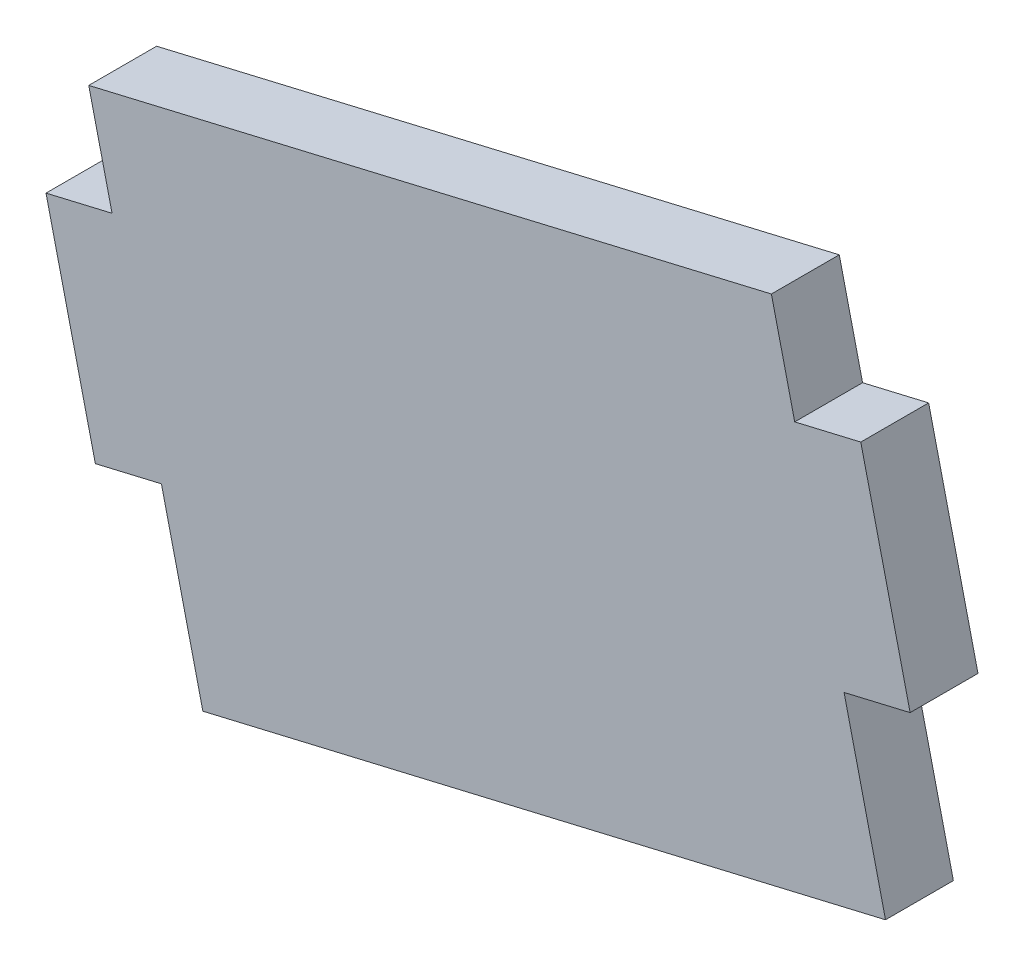
ISO-10303-21;
HEADER;
FILE_DESCRIPTION(('STEP AP214'),'2;1');
FILE_NAME('part.step','',(''),(''),'','','');
FILE_SCHEMA(('AUTOMOTIVE_DESIGN { 1 0 10303 214 1 1 1 1 }'));
ENDSEC;
DATA;
#1=APPLICATION_CONTEXT('core data for automotive mechanical design processes');
#2=APPLICATION_PROTOCOL_DEFINITION('international standard','automotive_design',2000,#1);
#3=PRODUCT_CONTEXT('',#1,'mechanical');
#4=PRODUCT('Part','Part','',(#3));
#5=PRODUCT_RELATED_PRODUCT_CATEGORY('part','',(#4));
#6=PRODUCT_DEFINITION_FORMATION('','',#4);
#7=PRODUCT_DEFINITION_CONTEXT('part definition',#1,'design');
#8=PRODUCT_DEFINITION('design','',#6,#7);
#9=PRODUCT_DEFINITION_SHAPE('','',#8);
#10=(LENGTH_UNIT() NAMED_UNIT(*) SI_UNIT(.MILLI.,.METRE.));
#11=(NAMED_UNIT(*) PLANE_ANGLE_UNIT() SI_UNIT($,.RADIAN.));
#12=(NAMED_UNIT(*) SI_UNIT($,.STERADIAN.) SOLID_ANGLE_UNIT());
#13=UNCERTAINTY_MEASURE_WITH_UNIT(LENGTH_MEASURE(1.E-05),#10,'distance_accuracy_value','');
#14=(GEOMETRIC_REPRESENTATION_CONTEXT(3) GLOBAL_UNCERTAINTY_ASSIGNED_CONTEXT((#13)) GLOBAL_UNIT_ASSIGNED_CONTEXT((#10,
#11,#12)) REPRESENTATION_CONTEXT('',''));
#15=CARTESIAN_POINT('',(0.,0.,0.));
#16=DIRECTION('',(0.,0.,1.));
#17=DIRECTION('',(1.,0.,0.));
#18=AXIS2_PLACEMENT_3D('',#15,#16,#17);
#19=CARTESIAN_POINT('',(643.040286554678,392.206492508057,3.));
#20=DIRECTION('',(0.229108301401089,-0.973400938066688,0.));
#21=DIRECTION('',(0.973400938066688,0.229108301401089,0.));
#22=AXIS2_PLACEMENT_3D('',#19,#20,#21);
#23=PLANE('',#22);
#24=DIRECTION('',(-0.973400938066688,-0.229108301401089,0.));
#25=VECTOR('',#24,1.);
#26=CARTESIAN_POINT('',(643.040286554678,392.206492508057,0.));
#27=LINE('',#26,#25);
#28=CARTESIAN_POINT('',(645.960489368878,392.893817412261,0.));
#29=VERTEX_POINT('',#28);
#30=CARTESIAN_POINT('',(643.040286554678,392.206492508057,0.));
#31=VERTEX_POINT('',#30);
#32=EDGE_CURVE('E124',#29,#31,#27,.T.);
#33=ORIENTED_EDGE('',*,*,#32,.T.);
#34=DIRECTION('',(0.,0.,-1.));
#35=VECTOR('',#34,1.);
#36=CARTESIAN_POINT('',(643.040286554678,392.206492508057,3.));
#37=LINE('',#36,#35);
#38=CARTESIAN_POINT('',(643.040286554678,392.206492508057,3.));
#39=VERTEX_POINT('',#38);
#40=EDGE_CURVE('E11',#39,#31,#37,.T.);
#41=ORIENTED_EDGE('',*,*,#40,.F.);
#42=DIRECTION('',(-0.973400938066688,-0.229108301401089,0.));
#43=VECTOR('',#42,1.);
#44=CARTESIAN_POINT('',(643.040286554678,392.206492508057,3.));
#45=LINE('',#44,#43);
#46=CARTESIAN_POINT('',(645.960489368878,392.893817412261,3.));
#47=VERTEX_POINT('',#46);
#48=EDGE_CURVE('E159',#47,#39,#45,.T.);
#49=ORIENTED_EDGE('',*,*,#48,.F.);
#50=DIRECTION('',(0.,0.,-1.));
#51=VECTOR('',#50,1.);
#52=CARTESIAN_POINT('',(645.960489368878,392.893817412261,3.));
#53=LINE('',#52,#51);
#54=EDGE_CURVE('E137',#47,#29,#53,.T.);
#55=ORIENTED_EDGE('',*,*,#54,.T.);
#56=EDGE_LOOP('',(#33,#41,#49,#55));
#57=FACE_BOUND('',#56,.T.);
#58=ADVANCED_FACE('F32',(#57),#23,.F.);
#59=CARTESIAN_POINT('',(643.040286554678,392.206492508057,3.));
#60=DIRECTION('',(-0.973400938066693,-0.229108301401068,0.));
#61=DIRECTION('',(0.229108301401069,-0.973400938066693,0.));
#62=AXIS2_PLACEMENT_3D('',#59,#60,#61);
#63=PLANE('',#62);
#64=DIRECTION('',(-0.229108301401068,0.973400938066693,0.));
#65=VECTOR('',#64,1.);
#66=CARTESIAN_POINT('',(643.040286554678,392.206492508057,0.));
#67=LINE('',#66,#65);
#68=CARTESIAN_POINT('',(642.009299198373,396.586796729357,0.));
#69=VERTEX_POINT('',#68);
#70=EDGE_CURVE('E120',#31,#69,#67,.T.);
#71=ORIENTED_EDGE('',*,*,#70,.T.);
#72=DIRECTION('',(0.,0.,-1.));
#73=VECTOR('',#72,1.);
#74=CARTESIAN_POINT('',(642.009299198373,396.586796729357,3.));
#75=LINE('',#74,#73);
#76=CARTESIAN_POINT('',(642.009299198373,396.586796729357,3.));
#77=VERTEX_POINT('',#76);
#78=EDGE_CURVE('E39',#77,#69,#75,.T.);
#79=ORIENTED_EDGE('',*,*,#78,.F.);
#80=DIRECTION('',(-0.229108301401068,0.973400938066693,0.));
#81=VECTOR('',#80,1.);
#82=CARTESIAN_POINT('',(643.040286554678,392.206492508057,3.));
#83=LINE('',#82,#81);
#84=EDGE_CURVE('E133',#39,#77,#83,.T.);
#85=ORIENTED_EDGE('',*,*,#84,.F.);
#86=ORIENTED_EDGE('',*,*,#40,.T.);
#87=EDGE_LOOP('',(#71,#79,#85,#86));
#88=FACE_BOUND('',#87,.T.);
#89=ADVANCED_FACE('F132',(#88),#63,.F.);
#90=CARTESIAN_POINT('',(642.009299198373,396.586796729357,3.));
#91=DIRECTION('',(0.229108301401082,-0.973400938066689,0.));
#92=DIRECTION('',(0.973400938066689,0.229108301401082,0.));
#93=AXIS2_PLACEMENT_3D('',#90,#91,#92);
#94=PLANE('',#93);
#95=DIRECTION('',(-0.973400938066689,-0.229108301401082,0.));
#96=VECTOR('',#95,1.);
#97=CARTESIAN_POINT('',(642.009299198373,396.586796729357,0.));
#98=LINE('',#97,#96);
#99=CARTESIAN_POINT('',(611.833870118305,389.484439385924,0.));
#100=VERTEX_POINT('',#99);
#101=EDGE_CURVE('E126',#69,#100,#98,.T.);
#102=ORIENTED_EDGE('',*,*,#101,.T.);
#103=DIRECTION('',(0.,0.,-1.));
#104=VECTOR('',#103,1.);
#105=CARTESIAN_POINT('',(611.833870118305,389.484439385924,3.));
#106=LINE('',#105,#104);
#107=CARTESIAN_POINT('',(611.833870118305,389.484439385924,3.));
#108=VERTEX_POINT('',#107);
#109=EDGE_CURVE('E205',#108,#100,#106,.T.);
#110=ORIENTED_EDGE('',*,*,#109,.F.);
#111=DIRECTION('',(-0.973400938066689,-0.229108301401082,0.));
#112=VECTOR('',#111,1.);
#113=CARTESIAN_POINT('',(642.009299198373,396.586796729357,3.));
#114=LINE('',#113,#112);
#115=EDGE_CURVE('E162',#77,#108,#114,.T.);
#116=ORIENTED_EDGE('',*,*,#115,.F.);
#117=ORIENTED_EDGE('',*,*,#78,.T.);
#118=EDGE_LOOP('',(#102,#110,#116,#117));
#119=FACE_BOUND('',#118,.T.);
#120=ADVANCED_FACE('F209',(#119),#94,.F.);
#121=CARTESIAN_POINT('',(612.86485747461,385.104135164624,3.));
#122=DIRECTION('',(0.973400938066691,0.229108301401074,0.));
#123=DIRECTION('',(-0.229108301401074,0.973400938066691,0.));
#124=AXIS2_PLACEMENT_3D('',#121,#122,#123);
#125=PLANE('',#124);
#126=DIRECTION('',(0.229108301401074,-0.973400938066691,0.));
#127=VECTOR('',#126,1.);
#128=CARTESIAN_POINT('',(612.86485747461,385.104135164624,0.));
#129=LINE('',#128,#127);
#130=CARTESIAN_POINT('',(612.86485747461,385.104135164624,0.));
#131=VERTEX_POINT('',#130);
#132=EDGE_CURVE('E141',#100,#131,#129,.T.);
#133=ORIENTED_EDGE('',*,*,#132,.T.);
#134=DIRECTION('',(0.,0.,-1.));
#135=VECTOR('',#134,1.);
#136=CARTESIAN_POINT('',(612.86485747461,385.104135164624,3.));
#137=LINE('',#136,#135);
#138=CARTESIAN_POINT('',(612.86485747461,385.104135164624,3.));
#139=VERTEX_POINT('',#138);
#140=EDGE_CURVE('E202',#139,#131,#137,.T.);
#141=ORIENTED_EDGE('',*,*,#140,.F.);
#142=DIRECTION('',(0.229108301401074,-0.973400938066691,0.));
#143=VECTOR('',#142,1.);
#144=CARTESIAN_POINT('',(612.86485747461,385.104135164624,3.));
#145=LINE('',#144,#143);
#146=EDGE_CURVE('E164',#108,#139,#145,.T.);
#147=ORIENTED_EDGE('',*,*,#146,.F.);
#148=ORIENTED_EDGE('',*,*,#109,.T.);
#149=EDGE_LOOP('',(#133,#141,#147,#148));
#150=FACE_BOUND('',#149,.T.);
#151=ADVANCED_FACE('F217',(#150),#125,.F.);
#152=CARTESIAN_POINT('',(609.94465466041,384.416810260421,3.));
#153=DIRECTION('',(0.229108301401089,-0.973400938066688,0.));
#154=DIRECTION('',(0.973400938066688,0.229108301401089,0.));
#155=AXIS2_PLACEMENT_3D('',#152,#153,#154);
#156=PLANE('',#155);
#157=DIRECTION('',(-0.973400938066688,-0.229108301401089,0.));
#158=VECTOR('',#157,1.);
#159=CARTESIAN_POINT('',(609.94465466041,384.416810260421,0.));
#160=LINE('',#159,#158);
#161=CARTESIAN_POINT('',(609.94465466041,384.416810260421,0.));
#162=VERTEX_POINT('',#161);
#163=EDGE_CURVE('E143',#131,#162,#160,.T.);
#164=ORIENTED_EDGE('',*,*,#163,.T.);
#165=DIRECTION('',(0.,0.,-1.));
#166=VECTOR('',#165,1.);
#167=CARTESIAN_POINT('',(609.94465466041,384.416810260421,3.));
#168=LINE('',#167,#166);
#169=CARTESIAN_POINT('',(609.94465466041,384.416810260421,3.));
#170=VERTEX_POINT('',#169);
#171=EDGE_CURVE('E199',#170,#162,#168,.T.);
#172=ORIENTED_EDGE('',*,*,#171,.F.);
#173=DIRECTION('',(-0.973400938066688,-0.229108301401089,0.));
#174=VECTOR('',#173,1.);
#175=CARTESIAN_POINT('',(609.94465466041,384.416810260421,3.));
#176=LINE('',#175,#174);
#177=EDGE_CURVE('E166',#139,#170,#176,.T.);
#178=ORIENTED_EDGE('',*,*,#177,.F.);
#179=ORIENTED_EDGE('',*,*,#140,.T.);
#180=EDGE_LOOP('',(#164,#172,#178,#179));
#181=FACE_BOUND('',#180,.T.);
#182=ADVANCED_FACE('F220',(#181),#156,.F.);
#183=CARTESIAN_POINT('',(612.125765689749,375.150033330025,3.));
#184=DIRECTION('',(0.973400938066686,0.229108301401096,0.));
#185=DIRECTION('',(-0.229108301401096,0.973400938066686,0.));
#186=AXIS2_PLACEMENT_3D('',#183,#184,#185);
#187=PLANE('',#186);
#188=DIRECTION('',(0.229108301401096,-0.973400938066686,0.));
#189=VECTOR('',#188,1.);
#190=CARTESIAN_POINT('',(612.125765689749,375.150033330025,0.));
#191=LINE('',#190,#189);
#192=CARTESIAN_POINT('',(612.125765689749,375.150033330025,0.));
#193=VERTEX_POINT('',#192);
#194=EDGE_CURVE('E145',#162,#193,#191,.T.);
#195=ORIENTED_EDGE('',*,*,#194,.T.);
#196=DIRECTION('',(0.,0.,-1.));
#197=VECTOR('',#196,1.);
#198=CARTESIAN_POINT('',(612.125765689749,375.150033330025,3.));
#199=LINE('',#198,#197);
#200=CARTESIAN_POINT('',(612.125765689749,375.150033330025,3.));
#201=VERTEX_POINT('',#200);
#202=EDGE_CURVE('E196',#201,#193,#199,.T.);
#203=ORIENTED_EDGE('',*,*,#202,.F.);
#204=DIRECTION('',(0.229108301401096,-0.973400938066686,0.));
#205=VECTOR('',#204,1.);
#206=CARTESIAN_POINT('',(612.125765689749,375.150033330025,3.));
#207=LINE('',#206,#205);
#208=EDGE_CURVE('E168',#170,#201,#207,.T.);
#209=ORIENTED_EDGE('',*,*,#208,.F.);
#210=ORIENTED_EDGE('',*,*,#171,.T.);
#211=EDGE_LOOP('',(#195,#203,#209,#210));
#212=FACE_BOUND('',#211,.T.);
#213=ADVANCED_FACE('F225',(#212),#187,.F.);
#214=CARTESIAN_POINT('',(612.125765689749,375.150033330025,3.));
#215=DIRECTION('',(-0.229108301401202,0.973400938066661,0.));
#216=DIRECTION('',(-0.973400938066661,-0.229108301401202,0.));
#217=AXIS2_PLACEMENT_3D('',#214,#215,#216);
#218=PLANE('',#217);
#219=DIRECTION('',(0.973400938066661,0.229108301401202,0.));
#220=VECTOR('',#219,1.);
#221=CARTESIAN_POINT('',(612.125765689749,375.150033330025,0.));
#222=LINE('',#221,#220);
#223=CARTESIAN_POINT('',(615.045968503949,375.837358234229,0.));
#224=VERTEX_POINT('',#223);
#225=EDGE_CURVE('E147',#193,#224,#222,.T.);
#226=ORIENTED_EDGE('',*,*,#225,.T.);
#227=DIRECTION('',(0.,0.,-1.));
#228=VECTOR('',#227,1.);
#229=CARTESIAN_POINT('',(615.045968503949,375.837358234229,3.));
#230=LINE('',#229,#228);
#231=CARTESIAN_POINT('',(615.045968503949,375.837358234229,3.));
#232=VERTEX_POINT('',#231);
#233=EDGE_CURVE('E193',#232,#224,#230,.T.);
#234=ORIENTED_EDGE('',*,*,#233,.F.);
#235=DIRECTION('',(0.973400938066661,0.229108301401202,0.));
#236=VECTOR('',#235,1.);
#237=CARTESIAN_POINT('',(612.125765689749,375.150033330025,3.));
#238=LINE('',#237,#236);
#239=EDGE_CURVE('E170',#201,#232,#238,.T.);
#240=ORIENTED_EDGE('',*,*,#239,.F.);
#241=ORIENTED_EDGE('',*,*,#202,.T.);
#242=EDGE_LOOP('',(#226,#234,#240,#241));
#243=FACE_BOUND('',#242,.T.);
#244=ADVANCED_FACE('F231',(#243),#218,.F.);
#245=CARTESIAN_POINT('',(616.878834915157,368.050150729695,3.));
#246=DIRECTION('',(0.973400938066693,0.229108301401065,0.));
#247=DIRECTION('',(-0.229108301401065,0.973400938066693,0.));
#248=AXIS2_PLACEMENT_3D('',#245,#246,#247);
#249=PLANE('',#248);
#250=DIRECTION('',(0.229108301401065,-0.973400938066693,0.));
#251=VECTOR('',#250,1.);
#252=CARTESIAN_POINT('',(616.878834915157,368.050150729695,0.));
#253=LINE('',#252,#251);
#254=CARTESIAN_POINT('',(616.878834915157,368.050150729695,0.));
#255=VERTEX_POINT('',#254);
#256=EDGE_CURVE('E149',#224,#255,#253,.T.);
#257=ORIENTED_EDGE('',*,*,#256,.T.);
#258=DIRECTION('',(0.,0.,-1.));
#259=VECTOR('',#258,1.);
#260=CARTESIAN_POINT('',(616.878834915157,368.050150729695,3.));
#261=LINE('',#260,#259);
#262=CARTESIAN_POINT('',(616.878834915157,368.050150729695,3.));
#263=VERTEX_POINT('',#262);
#264=EDGE_CURVE('E190',#263,#255,#261,.T.);
#265=ORIENTED_EDGE('',*,*,#264,.F.);
#266=DIRECTION('',(0.229108301401065,-0.973400938066693,0.));
#267=VECTOR('',#266,1.);
#268=CARTESIAN_POINT('',(616.878834915157,368.050150729695,3.));
#269=LINE('',#268,#267);
#270=EDGE_CURVE('E172',#232,#263,#269,.T.);
#271=ORIENTED_EDGE('',*,*,#270,.F.);
#272=ORIENTED_EDGE('',*,*,#233,.T.);
#273=EDGE_LOOP('',(#257,#265,#271,#272));
#274=FACE_BOUND('',#273,.T.);
#275=ADVANCED_FACE('F235',(#274),#249,.F.);
#276=CARTESIAN_POINT('',(616.878834915157,368.050150729695,3.));
#277=DIRECTION('',(-0.229108301401083,0.973400938066689,0.));
#278=DIRECTION('',(-0.973400938066689,-0.229108301401083,0.));
#279=AXIS2_PLACEMENT_3D('',#276,#277,#278);
#280=PLANE('',#279);
#281=DIRECTION('',(0.973400938066689,0.229108301401083,0.));
#282=VECTOR('',#281,1.);
#283=CARTESIAN_POINT('',(616.878834915157,368.050150729695,0.));
#284=LINE('',#283,#282);
#285=CARTESIAN_POINT('',(647.054263995225,375.152508073128,0.));
#286=VERTEX_POINT('',#285);
#287=EDGE_CURVE('E151',#255,#286,#284,.T.);
#288=ORIENTED_EDGE('',*,*,#287,.T.);
#289=DIRECTION('',(0.,0.,-1.));
#290=VECTOR('',#289,1.);
#291=CARTESIAN_POINT('',(647.054263995225,375.152508073128,3.));
#292=LINE('',#291,#290);
#293=CARTESIAN_POINT('',(647.054263995225,375.152508073128,3.));
#294=VERTEX_POINT('',#293);
#295=EDGE_CURVE('E187',#294,#286,#292,.T.);
#296=ORIENTED_EDGE('',*,*,#295,.F.);
#297=DIRECTION('',(0.973400938066689,0.229108301401083,0.));
#298=VECTOR('',#297,1.);
#299=CARTESIAN_POINT('',(616.878834915157,368.050150729695,3.));
#300=LINE('',#299,#298);
#301=EDGE_CURVE('E174',#263,#294,#300,.T.);
#302=ORIENTED_EDGE('',*,*,#301,.F.);
#303=ORIENTED_EDGE('',*,*,#264,.T.);
#304=EDGE_LOOP('',(#288,#296,#302,#303));
#305=FACE_BOUND('',#304,.T.);
#306=ADVANCED_FACE('F240',(#305),#280,.F.);
#307=CARTESIAN_POINT('',(647.054263995225,375.152508073128,3.));
#308=DIRECTION('',(-0.973400938066687,-0.229108301401091,0.));
#309=DIRECTION('',(0.229108301401091,-0.973400938066688,0.));
#310=AXIS2_PLACEMENT_3D('',#307,#308,#309);
#311=PLANE('',#310);
#312=DIRECTION('',(-0.229108301401091,0.973400938066687,0.));
#313=VECTOR('',#312,1.);
#314=CARTESIAN_POINT('',(647.054263995225,375.152508073128,0.));
#315=LINE('',#314,#313);
#316=CARTESIAN_POINT('',(645.221397584016,382.939715577662,0.));
#317=VERTEX_POINT('',#316);
#318=EDGE_CURVE('E153',#286,#317,#315,.T.);
#319=ORIENTED_EDGE('',*,*,#318,.T.);
#320=DIRECTION('',(0.,0.,-1.));
#321=VECTOR('',#320,1.);
#322=CARTESIAN_POINT('',(645.221397584016,382.939715577662,3.));
#323=LINE('',#322,#321);
#324=CARTESIAN_POINT('',(645.221397584016,382.939715577662,3.));
#325=VERTEX_POINT('',#324);
#326=EDGE_CURVE('E184',#325,#317,#323,.T.);
#327=ORIENTED_EDGE('',*,*,#326,.F.);
#328=DIRECTION('',(-0.229108301401091,0.973400938066687,0.));
#329=VECTOR('',#328,1.);
#330=CARTESIAN_POINT('',(647.054263995225,375.152508073128,3.));
#331=LINE('',#330,#329);
#332=EDGE_CURVE('E176',#294,#325,#331,.T.);
#333=ORIENTED_EDGE('',*,*,#332,.F.);
#334=ORIENTED_EDGE('',*,*,#295,.T.);
#335=EDGE_LOOP('',(#319,#327,#333,#334));
#336=FACE_BOUND('',#335,.T.);
#337=ADVANCED_FACE('F244',(#336),#311,.F.);
#338=CARTESIAN_POINT('',(645.221397584016,382.939715577662,3.));
#339=DIRECTION('',(-0.229108301401106,0.973400938066684,0.));
#340=DIRECTION('',(-0.973400938066684,-0.229108301401106,0.));
#341=AXIS2_PLACEMENT_3D('',#338,#339,#340);
#342=PLANE('',#341);
#343=DIRECTION('',(0.973400938066684,0.229108301401106,0.));
#344=VECTOR('',#343,1.);
#345=CARTESIAN_POINT('',(645.221397584016,382.939715577662,0.));
#346=LINE('',#345,#344);
#347=CARTESIAN_POINT('',(648.141600398216,383.627040481865,0.));
#348=VERTEX_POINT('',#347);
#349=EDGE_CURVE('E155',#317,#348,#346,.T.);
#350=ORIENTED_EDGE('',*,*,#349,.T.);
#351=DIRECTION('',(0.,0.,-1.));
#352=VECTOR('',#351,1.);
#353=CARTESIAN_POINT('',(648.141600398216,383.627040481865,3.));
#354=LINE('',#353,#352);
#355=CARTESIAN_POINT('',(648.141600398216,383.627040481865,3.));
#356=VERTEX_POINT('',#355);
#357=EDGE_CURVE('E181',#356,#348,#354,.T.);
#358=ORIENTED_EDGE('',*,*,#357,.F.);
#359=DIRECTION('',(0.973400938066684,0.229108301401106,0.));
#360=VECTOR('',#359,1.);
#361=CARTESIAN_POINT('',(645.221397584016,382.939715577662,3.));
#362=LINE('',#361,#360);
#363=EDGE_CURVE('E51',#325,#356,#362,.T.);
#364=ORIENTED_EDGE('',*,*,#363,.F.);
#365=ORIENTED_EDGE('',*,*,#326,.T.);
#366=EDGE_LOOP('',(#350,#358,#364,#365));
#367=FACE_BOUND('',#366,.T.);
#368=ADVANCED_FACE('F248',(#367),#342,.F.);
#369=CARTESIAN_POINT('',(648.141600398216,383.627040481865,3.));
#370=DIRECTION('',(-0.973400938066688,-0.229108301401087,0.));
#371=DIRECTION('',(0.229108301401087,-0.973400938066688,0.));
#372=AXIS2_PLACEMENT_3D('',#369,#370,#371);
#373=PLANE('',#372);
#374=DIRECTION('',(-0.229108301401087,0.973400938066688,0.));
#375=VECTOR('',#374,1.);
#376=CARTESIAN_POINT('',(648.141600398216,383.627040481865,0.));
#377=LINE('',#376,#375);
#378=EDGE_CURVE('E157',#348,#29,#377,.T.);
#379=ORIENTED_EDGE('',*,*,#378,.T.);
#380=ORIENTED_EDGE('',*,*,#54,.F.);
#381=DIRECTION('',(-0.229108301401087,0.973400938066688,0.));
#382=VECTOR('',#381,1.);
#383=CARTESIAN_POINT('',(648.141600398216,383.627040481865,3.));
#384=LINE('',#383,#382);
#385=EDGE_CURVE('E46',#356,#47,#384,.T.);
#386=ORIENTED_EDGE('',*,*,#385,.F.);
#387=ORIENTED_EDGE('',*,*,#357,.T.);
#388=EDGE_LOOP('',(#379,#380,#386,#387));
#389=FACE_BOUND('',#388,.T.);
#390=ADVANCED_FACE('F250',(#389),#373,.F.);
#391=CARTESIAN_POINT('',(645.960489368878,392.893817412261,3.));
#392=DIRECTION('',(0.,0.,1.));
#393=DIRECTION('',(1.,0.,0.));
#394=AXIS2_PLACEMENT_3D('',#391,#392,#393);
#395=PLANE('',#394);
#396=ORIENTED_EDGE('',*,*,#48,.T.);
#397=ORIENTED_EDGE('',*,*,#84,.T.);
#398=ORIENTED_EDGE('',*,*,#115,.T.);
#399=ORIENTED_EDGE('',*,*,#146,.T.);
#400=ORIENTED_EDGE('',*,*,#177,.T.);
#401=ORIENTED_EDGE('',*,*,#208,.T.);
#402=ORIENTED_EDGE('',*,*,#239,.T.);
#403=ORIENTED_EDGE('',*,*,#270,.T.);
#404=ORIENTED_EDGE('',*,*,#301,.T.);
#405=ORIENTED_EDGE('',*,*,#332,.T.);
#406=ORIENTED_EDGE('',*,*,#363,.T.);
#407=ORIENTED_EDGE('',*,*,#385,.T.);
#408=EDGE_LOOP('',(#396,#397,#398,#399,#400,#401,#402,#403,#404,#405,#406,#407));
#409=FACE_BOUND('',#408,.T.);
#410=ADVANCED_FACE('F212',(#409),#395,.T.);
#411=CARTESIAN_POINT('',(645.960489368878,392.893817412261,0.));
#412=DIRECTION('',(0.,0.,1.));
#413=DIRECTION('',(1.,0.,0.));
#414=AXIS2_PLACEMENT_3D('',#411,#412,#413);
#415=PLANE('',#414);
#416=ORIENTED_EDGE('',*,*,#32,.F.);
#417=ORIENTED_EDGE('',*,*,#378,.F.);
#418=ORIENTED_EDGE('',*,*,#349,.F.);
#419=ORIENTED_EDGE('',*,*,#318,.F.);
#420=ORIENTED_EDGE('',*,*,#287,.F.);
#421=ORIENTED_EDGE('',*,*,#256,.F.);
#422=ORIENTED_EDGE('',*,*,#225,.F.);
#423=ORIENTED_EDGE('',*,*,#194,.F.);
#424=ORIENTED_EDGE('',*,*,#163,.F.);
#425=ORIENTED_EDGE('',*,*,#132,.F.);
#426=ORIENTED_EDGE('',*,*,#101,.F.);
#427=ORIENTED_EDGE('',*,*,#70,.F.);
#428=EDGE_LOOP('',(#416,#417,#418,#419,#420,#421,#422,#423,#424,#425,#426,#427));
#429=FACE_BOUND('',#428,.T.);
#430=ADVANCED_FACE('F121',(#429),#415,.F.);
#431=CLOSED_SHELL('',(#58,#89,#120,#151,#182,#213,#244,#275,#306,#337,#368,#390,#410,#430));
#432=MANIFOLD_SOLID_BREP('B2',#431);
#433=ADVANCED_BREP_SHAPE_REPRESENTATION('',(#18,#432),#14);
#434=SHAPE_DEFINITION_REPRESENTATION(#9,#433);
ENDSEC;
END-ISO-10303-21;
